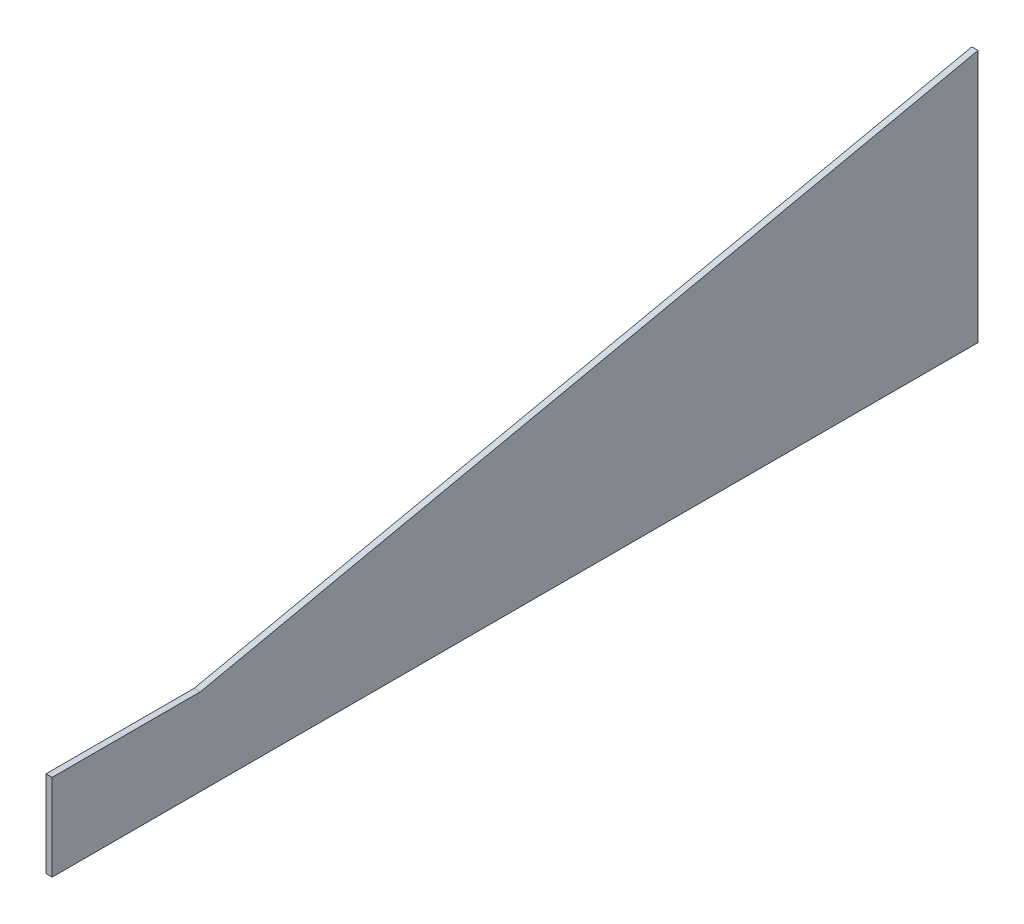
ISO-10303-21;
HEADER;
FILE_DESCRIPTION(('STEP AP214'),'2;1');
FILE_NAME('part.step','',(''),(''),'','','');
FILE_SCHEMA(('AUTOMOTIVE_DESIGN { 1 0 10303 214 1 1 1 1 }'));
ENDSEC;
DATA;
#1=APPLICATION_CONTEXT('core data for automotive mechanical design processes');
#2=APPLICATION_PROTOCOL_DEFINITION('international standard','automotive_design',2000,#1);
#3=PRODUCT_CONTEXT('',#1,'mechanical');
#4=PRODUCT('Part','Part','',(#3));
#5=PRODUCT_RELATED_PRODUCT_CATEGORY('part','',(#4));
#6=PRODUCT_DEFINITION_FORMATION('','',#4);
#7=PRODUCT_DEFINITION_CONTEXT('part definition',#1,'design');
#8=PRODUCT_DEFINITION('design','',#6,#7);
#9=PRODUCT_DEFINITION_SHAPE('','',#8);
#10=(LENGTH_UNIT() NAMED_UNIT(*) SI_UNIT(.MILLI.,.METRE.));
#11=(NAMED_UNIT(*) PLANE_ANGLE_UNIT() SI_UNIT($,.RADIAN.));
#12=(NAMED_UNIT(*) SI_UNIT($,.STERADIAN.) SOLID_ANGLE_UNIT());
#13=UNCERTAINTY_MEASURE_WITH_UNIT(LENGTH_MEASURE(1.E-05),#10,'distance_accuracy_value','');
#14=(GEOMETRIC_REPRESENTATION_CONTEXT(3) GLOBAL_UNCERTAINTY_ASSIGNED_CONTEXT((#13)) GLOBAL_UNIT_ASSIGNED_CONTEXT((#10,
#11,#12)) REPRESENTATION_CONTEXT('',''));
#15=CARTESIAN_POINT('',(0.,0.,0.));
#16=DIRECTION('',(0.,0.,1.));
#17=DIRECTION('',(1.,0.,0.));
#18=AXIS2_PLACEMENT_3D('',#15,#16,#17);
#19=CARTESIAN_POINT('',(29.99,70.0099999999999,850.));
#20=DIRECTION('',(0.,0.,1.));
#21=DIRECTION('',(0.,-1.,0.));
#22=AXIS2_PLACEMENT_3D('',#19,#20,#21);
#23=PLANE('',#22);
#24=DIRECTION('',(0.,-1.,0.));
#25=VECTOR('',#24,1.);
#26=CARTESIAN_POINT('',(35.,102.5,850.));
#27=LINE('',#26,#25);
#28=CARTESIAN_POINT('',(35.,70.,850.));
#29=VERTEX_POINT('',#28);
#30=CARTESIAN_POINT('',(35.,-1.04620901785618E-13,850.));
#31=VERTEX_POINT('',#30);
#32=EDGE_CURVE('E89',#29,#31,#27,.T.);
#33=ORIENTED_EDGE('',*,*,#32,.F.);
#34=DIRECTION('',(1.,0.,0.));
#35=VECTOR('',#34,1.);
#36=CARTESIAN_POINT('',(32.5,69.9999999999999,850.));
#37=LINE('',#36,#35);
#38=CARTESIAN_POINT('',(30.,69.9999999999999,850.));
#39=VERTEX_POINT('',#38);
#40=EDGE_CURVE('E75',#39,#29,#37,.T.);
#41=ORIENTED_EDGE('',*,*,#40,.F.);
#42=DIRECTION('',(0.,1.,0.));
#43=VECTOR('',#42,1.);
#44=CARTESIAN_POINT('',(30.,102.5,850.));
#45=LINE('',#44,#43);
#46=CARTESIAN_POINT('',(30.,0.,850.));
#47=VERTEX_POINT('',#46);
#48=EDGE_CURVE('E62',#47,#39,#45,.T.);
#49=ORIENTED_EDGE('',*,*,#48,.F.);
#50=DIRECTION('',(-1.,0.,0.));
#51=VECTOR('',#50,1.);
#52=CARTESIAN_POINT('',(32.5,-1.02140518265514E-13,850.));
#53=LINE('',#52,#51);
#54=EDGE_CURVE('E21',#31,#47,#53,.T.);
#55=ORIENTED_EDGE('',*,*,#54,.F.);
#56=EDGE_LOOP('',(#33,#41,#49,#55));
#57=FACE_BOUND('',#56,.T.);
#58=ADVANCED_FACE('F17',(#57),#23,.T.);
#59=CARTESIAN_POINT('',(29.99,-1.02141718718985E-13,850.01));
#60=DIRECTION('',(0.,-1.,0.));
#61=DIRECTION('',(0.,0.,-1.));
#62=AXIS2_PLACEMENT_3D('',#59,#60,#61);
#63=PLANE('',#62);
#64=DIRECTION('',(0.,0.,-1.));
#65=VECTOR('',#64,1.);
#66=CARTESIAN_POINT('',(35.,-1.06536415973857E-13,475.));
#67=LINE('',#66,#65);
#68=CARTESIAN_POINT('',(35.,0.,100.));
#69=VERTEX_POINT('',#68);
#70=EDGE_CURVE('E71',#31,#69,#67,.T.);
#71=ORIENTED_EDGE('',*,*,#70,.F.);
#72=ORIENTED_EDGE('',*,*,#54,.T.);
#73=DIRECTION('',(0.,0.,1.));
#74=VECTOR('',#73,1.);
#75=CARTESIAN_POINT('',(30.,0.,475.));
#76=LINE('',#75,#74);
#77=CARTESIAN_POINT('',(30.,0.,100.));
#78=VERTEX_POINT('',#77);
#79=EDGE_CURVE('E69',#78,#47,#76,.T.);
#80=ORIENTED_EDGE('',*,*,#79,.F.);
#81=DIRECTION('',(-1.,0.,0.));
#82=VECTOR('',#81,1.);
#83=CARTESIAN_POINT('',(32.5,0.,100.));
#84=LINE('',#83,#82);
#85=EDGE_CURVE('E94',#69,#78,#84,.T.);
#86=ORIENTED_EDGE('',*,*,#85,.F.);
#87=EDGE_LOOP('',(#71,#72,#80,#86));
#88=FACE_BOUND('',#87,.T.);
#89=ADVANCED_FACE('F67',(#88),#63,.T.);
#90=CARTESIAN_POINT('',(30.,-0.010000000000101,99.99));
#91=DIRECTION('',(-1.,0.,0.));
#92=DIRECTION('',(0.,0.,1.));
#93=AXIS2_PLACEMENT_3D('',#90,#91,#92);
#94=PLANE('',#93);
#95=DIRECTION('',(0.,0.,1.));
#96=VECTOR('',#95,1.);
#97=CARTESIAN_POINT('',(30.,70.0000000000001,789.999999999999));
#98=LINE('',#97,#96);
#99=CARTESIAN_POINT('',(30.,70.0000000000003,729.999999999998));
#100=VERTEX_POINT('',#99);
#101=EDGE_CURVE('E77',#100,#39,#98,.T.);
#102=ORIENTED_EDGE('',*,*,#101,.F.);
#103=DIRECTION('',(0.,-0.209529088730873,0.977802414077409));
#104=VECTOR('',#103,1.);
#105=CARTESIAN_POINT('',(30.,137.5,414.999999999999));
#106=LINE('',#105,#104);
#107=CARTESIAN_POINT('',(30.,205.,100.));
#108=VERTEX_POINT('',#107);
#109=EDGE_CURVE('E96',#108,#100,#106,.T.);
#110=ORIENTED_EDGE('',*,*,#109,.F.);
#111=DIRECTION('',(0.,1.,0.));
#112=VECTOR('',#111,1.);
#113=CARTESIAN_POINT('',(30.,102.5,100.));
#114=LINE('',#113,#112);
#115=EDGE_CURVE('E81',#78,#108,#114,.T.);
#116=ORIENTED_EDGE('',*,*,#115,.F.);
#117=ORIENTED_EDGE('',*,*,#79,.T.);
#118=ORIENTED_EDGE('',*,*,#48,.T.);
#119=EDGE_LOOP('',(#102,#110,#116,#117,#118));
#120=FACE_BOUND('',#119,.T.);
#121=ADVANCED_FACE('F79',(#120),#94,.T.);
#122=CARTESIAN_POINT('',(29.99,70.0000000000003,729.989999999998));
#123=DIRECTION('',(0.,1.,0.));
#124=DIRECTION('',(0.,0.,1.));
#125=AXIS2_PLACEMENT_3D('',#122,#123,#124);
#126=PLANE('',#125);
#127=DIRECTION('',(0.,0.,1.));
#128=VECTOR('',#127,1.);
#129=CARTESIAN_POINT('',(35.,70.0000000000003,475.));
#130=LINE('',#129,#128);
#131=CARTESIAN_POINT('',(35.,70.0000000000003,729.999999999998));
#132=VERTEX_POINT('',#131);
#133=EDGE_CURVE('E86',#132,#29,#130,.T.);
#134=ORIENTED_EDGE('',*,*,#133,.F.);
#135=DIRECTION('',(1.,0.,0.));
#136=VECTOR('',#135,1.);
#137=CARTESIAN_POINT('',(32.5,70.0000000000005,729.999999999998));
#138=LINE('',#137,#136);
#139=EDGE_CURVE('E99',#100,#132,#138,.T.);
#140=ORIENTED_EDGE('',*,*,#139,.F.);
#141=ORIENTED_EDGE('',*,*,#101,.T.);
#142=ORIENTED_EDGE('',*,*,#40,.T.);
#143=EDGE_LOOP('',(#134,#140,#141,#142));
#144=FACE_BOUND('',#143,.T.);
#145=ADVANCED_FACE('F107',(#144),#126,.T.);
#146=CARTESIAN_POINT('',(35.,-0.010000000000101,850.01));
#147=DIRECTION('',(1.,0.,0.));
#148=DIRECTION('',(0.,0.,-1.));
#149=AXIS2_PLACEMENT_3D('',#146,#147,#148);
#150=PLANE('',#149);
#151=ORIENTED_EDGE('',*,*,#32,.T.);
#152=ORIENTED_EDGE('',*,*,#70,.T.);
#153=DIRECTION('',(0.,-1.,0.));
#154=VECTOR('',#153,1.);
#155=CARTESIAN_POINT('',(35.,102.5,100.));
#156=LINE('',#155,#154);
#157=CARTESIAN_POINT('',(35.,205.,100.));
#158=VERTEX_POINT('',#157);
#159=EDGE_CURVE('E36',#158,#69,#156,.T.);
#160=ORIENTED_EDGE('',*,*,#159,.F.);
#161=DIRECTION('',(0.,0.209529088730873,-0.977802414077409));
#162=VECTOR('',#161,1.);
#163=CARTESIAN_POINT('',(35.,137.5,414.999999999999));
#164=LINE('',#163,#162);
#165=EDGE_CURVE('E27',#132,#158,#164,.T.);
#166=ORIENTED_EDGE('',*,*,#165,.F.);
#167=ORIENTED_EDGE('',*,*,#133,.T.);
#168=EDGE_LOOP('',(#151,#152,#160,#166,#167));
#169=FACE_BOUND('',#168,.T.);
#170=ADVANCED_FACE('F105',(#169),#150,.T.);
#171=CARTESIAN_POINT('',(29.99,-0.0100000000000122,100.));
#172=DIRECTION('',(0.,0.,-1.));
#173=DIRECTION('',(0.,1.,0.));
#174=AXIS2_PLACEMENT_3D('',#171,#172,#173);
#175=PLANE('',#174);
#176=ORIENTED_EDGE('',*,*,#159,.T.);
#177=ORIENTED_EDGE('',*,*,#85,.T.);
#178=ORIENTED_EDGE('',*,*,#115,.T.);
#179=DIRECTION('',(-1.,0.,0.));
#180=VECTOR('',#179,1.);
#181=CARTESIAN_POINT('',(32.5,205.,99.9999999999999));
#182=LINE('',#181,#180);
#183=EDGE_CURVE('E11',#158,#108,#182,.T.);
#184=ORIENTED_EDGE('',*,*,#183,.F.);
#185=EDGE_LOOP('',(#176,#177,#178,#184));
#186=FACE_BOUND('',#185,.T.);
#187=ADVANCED_FACE('F109',(#186),#175,.T.);
#188=CARTESIAN_POINT('',(29.99,205.002095290887,99.9902219758592));
#189=DIRECTION('',(0.,0.97780241407741,0.209529088730873));
#190=DIRECTION('',(0.,-0.209529088730873,0.97780241407741));
#191=AXIS2_PLACEMENT_3D('',#188,#189,#190);
#192=PLANE('',#191);
#193=ORIENTED_EDGE('',*,*,#165,.T.);
#194=ORIENTED_EDGE('',*,*,#183,.T.);
#195=ORIENTED_EDGE('',*,*,#109,.T.);
#196=ORIENTED_EDGE('',*,*,#139,.T.);
#197=EDGE_LOOP('',(#193,#194,#195,#196));
#198=FACE_BOUND('',#197,.T.);
#199=ADVANCED_FACE('F19',(#198),#192,.T.);
#200=CLOSED_SHELL('',(#58,#89,#121,#145,#170,#187,#199));
#201=MANIFOLD_SOLID_BREP('B1',#200);
#202=ADVANCED_BREP_SHAPE_REPRESENTATION('',(#18,#201),#14);
#203=SHAPE_DEFINITION_REPRESENTATION(#9,#202);
ENDSEC;
END-ISO-10303-21;
